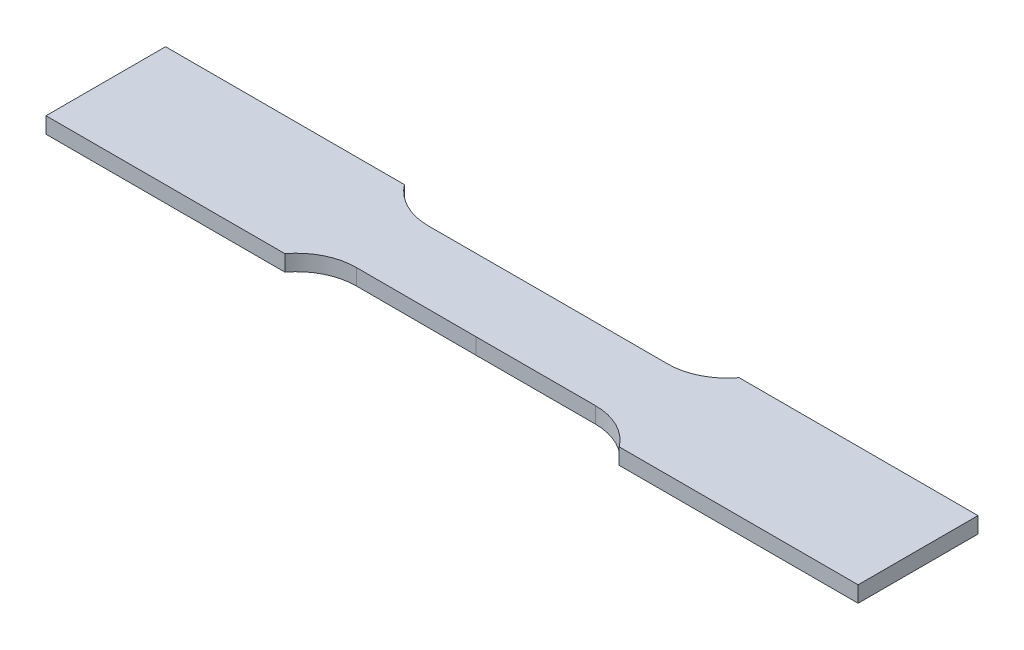
ISO-10303-21;
HEADER;
FILE_DESCRIPTION(('STEP AP214'),'2;1');
FILE_NAME('part.step','',(''),(''),'','','');
FILE_SCHEMA(('AUTOMOTIVE_DESIGN { 1 0 10303 214 1 1 1 1 }'));
ENDSEC;
DATA;
#1=APPLICATION_CONTEXT('core data for automotive mechanical design processes');
#2=APPLICATION_PROTOCOL_DEFINITION('international standard','automotive_design',2000,#1);
#3=PRODUCT_CONTEXT('',#1,'mechanical');
#4=PRODUCT('Part','Part','',(#3));
#5=PRODUCT_RELATED_PRODUCT_CATEGORY('part','',(#4));
#6=PRODUCT_DEFINITION_FORMATION('','',#4);
#7=PRODUCT_DEFINITION_CONTEXT('part definition',#1,'design');
#8=PRODUCT_DEFINITION('design','',#6,#7);
#9=PRODUCT_DEFINITION_SHAPE('','',#8);
#10=(LENGTH_UNIT() NAMED_UNIT(*) SI_UNIT(.MILLI.,.METRE.));
#11=(NAMED_UNIT(*) PLANE_ANGLE_UNIT() SI_UNIT($,.RADIAN.));
#12=(NAMED_UNIT(*) SI_UNIT($,.STERADIAN.) SOLID_ANGLE_UNIT());
#13=UNCERTAINTY_MEASURE_WITH_UNIT(LENGTH_MEASURE(1.E-05),#10,'distance_accuracy_value','');
#14=(GEOMETRIC_REPRESENTATION_CONTEXT(3) GLOBAL_UNCERTAINTY_ASSIGNED_CONTEXT((#13)) GLOBAL_UNIT_ASSIGNED_CONTEXT((#10,
#11,#12)) REPRESENTATION_CONTEXT('',''));
#15=CARTESIAN_POINT('',(0.,0.,0.));
#16=DIRECTION('',(0.,0.,1.));
#17=DIRECTION('',(1.,0.,0.));
#18=AXIS2_PLACEMENT_3D('',#15,#16,#17);
#19=CARTESIAN_POINT('',(0.,3.357,-12.5450081546003));
#20=DIRECTION('',(0.,0.,-1.));
#21=DIRECTION('',(-1.,0.,0.));
#22=AXIS2_PLACEMENT_3D('',#19,#20,#21);
#23=PLANE('',#22);
#24=DIRECTION('',(1.,0.,0.));
#25=VECTOR('',#24,1.);
#26=CARTESIAN_POINT('',(0.,0.,-12.5450081546003));
#27=LINE('',#26,#25);
#28=CARTESIAN_POINT('',(35.,0.,-12.5450081546003));
#29=VERTEX_POINT('',#28);
#30=CARTESIAN_POINT('',(85.,0.,-12.5450081546003));
#31=VERTEX_POINT('',#30);
#32=EDGE_CURVE('E168',#29,#31,#27,.T.);
#33=ORIENTED_EDGE('',*,*,#32,.F.);
#34=DIRECTION('',(0.,-1.,0.));
#35=VECTOR('',#34,1.);
#36=CARTESIAN_POINT('',(35.,3.357,-12.5450081546003));
#37=LINE('',#36,#35);
#38=CARTESIAN_POINT('',(35.,3.357,-12.5450081546003));
#39=VERTEX_POINT('',#38);
#40=EDGE_CURVE('E11',#39,#29,#37,.T.);
#41=ORIENTED_EDGE('',*,*,#40,.F.);
#42=DIRECTION('',(1.,0.,0.));
#43=VECTOR('',#42,1.);
#44=CARTESIAN_POINT('',(0.,3.357,-12.5450081546003));
#45=LINE('',#44,#43);
#46=CARTESIAN_POINT('',(85.,3.357,-12.5450081546003));
#47=VERTEX_POINT('',#46);
#48=EDGE_CURVE('E201',#39,#47,#45,.T.);
#49=ORIENTED_EDGE('',*,*,#48,.T.);
#50=DIRECTION('',(0.,-1.,0.));
#51=VECTOR('',#50,1.);
#52=CARTESIAN_POINT('',(85.,3.357,-12.5450081546003));
#53=LINE('',#52,#51);
#54=EDGE_CURVE('E53',#47,#31,#53,.T.);
#55=ORIENTED_EDGE('',*,*,#54,.T.);
#56=EDGE_LOOP('',(#33,#41,#49,#55));
#57=FACE_BOUND('',#56,.T.);
#58=ADVANCED_FACE('F37',(#57),#23,.T.);
#59=CARTESIAN_POINT('',(25.00749999865,3.357,-20.0549977500006));
#60=DIRECTION('',(0.,-1.,0.));
#61=DIRECTION('',(0.,0.,-1.));
#62=AXIS2_PLACEMENT_3D('',#59,#60,#61);
#63=CYLINDRICAL_SURFACE('',#62,12.5);
#64=CARTESIAN_POINT('',(25.00749999865,0.,-20.0549977500006));
#65=DIRECTION('',(0.,1.,0.));
#66=DIRECTION('',(0.,0.,1.));
#67=AXIS2_PLACEMENT_3D('',#64,#65,#66);
#68=CIRCLE('',#67,12.5);
#69=CARTESIAN_POINT('',(25.,0.,-7.55500000000001));
#70=VERTEX_POINT('',#69);
#71=EDGE_CURVE('E170',#29,#70,#68,.F.);
#72=ORIENTED_EDGE('',*,*,#71,.T.);
#73=DIRECTION('',(0.,-1.,0.));
#74=VECTOR('',#73,1.);
#75=CARTESIAN_POINT('',(25.,3.357,-7.55500000000001));
#76=LINE('',#75,#74);
#77=CARTESIAN_POINT('',(25.,3.357,-7.55500000000001));
#78=VERTEX_POINT('',#77);
#79=EDGE_CURVE('E45',#78,#70,#76,.T.);
#80=ORIENTED_EDGE('',*,*,#79,.F.);
#81=CARTESIAN_POINT('',(25.00749999865,3.357,-20.0549977500006));
#82=DIRECTION('',(0.,1.,0.));
#83=DIRECTION('',(0.,0.,1.));
#84=AXIS2_PLACEMENT_3D('',#81,#82,#83);
#85=CIRCLE('',#84,12.5);
#86=EDGE_CURVE('E250',#39,#78,#85,.F.);
#87=ORIENTED_EDGE('',*,*,#86,.F.);
#88=ORIENTED_EDGE('',*,*,#40,.T.);
#89=EDGE_LOOP('',(#72,#80,#87,#88));
#90=FACE_BOUND('',#89,.T.);
#91=ADVANCED_FACE('F283',(#90),#63,.F.);
#92=CARTESIAN_POINT('',(0.00454199836487909,3.357,-7.56999727480099));
#93=DIRECTION('',(-0.000599999891999831,0.,0.999999820000049));
#94=DIRECTION('',(0.999999820000049,0.,0.000599999891999831));
#95=AXIS2_PLACEMENT_3D('',#92,#93,#94);
#96=PLANE('',#95);
#97=DIRECTION('',(-0.999999820000049,0.,-0.000599999891999831));
#98=VECTOR('',#97,1.);
#99=CARTESIAN_POINT('',(0.00454199836487909,0.,-7.56999727480099));
#100=LINE('',#99,#98);
#101=CARTESIAN_POINT('',(0.,0.,-7.57));
#102=VERTEX_POINT('',#101);
#103=EDGE_CURVE('E172',#70,#102,#100,.T.);
#104=ORIENTED_EDGE('',*,*,#103,.T.);
#105=DIRECTION('',(0.,-1.,0.));
#106=VECTOR('',#105,1.);
#107=CARTESIAN_POINT('',(0.,3.357,-7.57));
#108=LINE('',#107,#106);
#109=CARTESIAN_POINT('',(0.,3.357,-7.57));
#110=VERTEX_POINT('',#109);
#111=EDGE_CURVE('E222',#110,#102,#108,.T.);
#112=ORIENTED_EDGE('',*,*,#111,.F.);
#113=DIRECTION('',(-0.999999820000049,0.,-0.000599999891999831));
#114=VECTOR('',#113,1.);
#115=CARTESIAN_POINT('',(0.00454199836487909,3.357,-7.56999727480099));
#116=LINE('',#115,#114);
#117=EDGE_CURVE('E231',#78,#110,#116,.T.);
#118=ORIENTED_EDGE('',*,*,#117,.F.);
#119=ORIENTED_EDGE('',*,*,#79,.T.);
#120=EDGE_LOOP('',(#104,#112,#118,#119));
#121=FACE_BOUND('',#120,.T.);
#122=ADVANCED_FACE('F229',(#121),#96,.F.);
#123=CARTESIAN_POINT('',(-0.0105979792279621,3.357,-7.56998516282909));
#124=DIRECTION('',(0.0013999986280022,0.,0.999999020001441));
#125=DIRECTION('',(0.999999020001441,0.,-0.0013999986280022));
#126=AXIS2_PLACEMENT_3D('',#123,#124,#125);
#127=PLANE('',#126);
#128=DIRECTION('',(-0.999999020001441,0.,0.0013999986280022));
#129=VECTOR('',#128,1.);
#130=CARTESIAN_POINT('',(-0.0105979792279621,0.,-7.56998516282909));
#131=LINE('',#130,#129);
#132=CARTESIAN_POINT('',(-25.,0.,-7.535));
#133=VERTEX_POINT('',#132);
#134=EDGE_CURVE('E174',#102,#133,#131,.T.);
#135=ORIENTED_EDGE('',*,*,#134,.T.);
#136=DIRECTION('',(0.,-1.,0.));
#137=VECTOR('',#136,1.);
#138=CARTESIAN_POINT('',(-25.,3.357,-7.535));
#139=LINE('',#138,#137);
#140=CARTESIAN_POINT('',(-25.,3.357,-7.535));
#141=VERTEX_POINT('',#140);
#142=EDGE_CURVE('E220',#141,#133,#139,.T.);
#143=ORIENTED_EDGE('',*,*,#142,.F.);
#144=DIRECTION('',(-0.999999020001441,0.,0.0013999986280022));
#145=VECTOR('',#144,1.);
#146=CARTESIAN_POINT('',(-0.0105979792279621,3.357,-7.56998516282909));
#147=LINE('',#146,#145);
#148=EDGE_CURVE('E244',#110,#141,#147,.T.);
#149=ORIENTED_EDGE('',*,*,#148,.F.);
#150=ORIENTED_EDGE('',*,*,#111,.T.);
#151=EDGE_LOOP('',(#135,#143,#149,#150));
#152=FACE_BOUND('',#151,.T.);
#153=ADVANCED_FACE('F241',(#152),#127,.F.);
#154=CARTESIAN_POINT('',(-25.01749998285,3.357,-20.034987750018));
#155=DIRECTION('',(0.,-1.,0.));
#156=DIRECTION('',(0.,0.,-1.));
#157=AXIS2_PLACEMENT_3D('',#154,#155,#156);
#158=CYLINDRICAL_SURFACE('',#157,12.5);
#159=CARTESIAN_POINT('',(-25.01749998285,0.,-20.034987750018));
#160=DIRECTION('',(0.,1.,0.));
#161=DIRECTION('',(0.,0.,1.));
#162=AXIS2_PLACEMENT_3D('',#159,#160,#161);
#163=CIRCLE('',#162,12.5);
#164=CARTESIAN_POINT('',(-35.,0.,-12.511710976723));
#165=VERTEX_POINT('',#164);
#166=EDGE_CURVE('E177',#165,#133,#163,.T.);
#167=ORIENTED_EDGE('',*,*,#166,.F.);
#168=DIRECTION('',(0.,-1.,0.));
#169=VECTOR('',#168,1.);
#170=CARTESIAN_POINT('',(-35.,3.357,-12.511710976723));
#171=LINE('',#170,#169);
#172=CARTESIAN_POINT('',(-35.,3.357,-12.511710976723));
#173=VERTEX_POINT('',#172);
#174=EDGE_CURVE('E218',#173,#165,#171,.T.);
#175=ORIENTED_EDGE('',*,*,#174,.F.);
#176=CARTESIAN_POINT('',(-25.01749998285,3.357,-20.034987750018));
#177=DIRECTION('',(0.,1.,0.));
#178=DIRECTION('',(0.,0.,1.));
#179=AXIS2_PLACEMENT_3D('',#176,#177,#178);
#180=CIRCLE('',#179,12.5);
#181=EDGE_CURVE('E246',#173,#141,#180,.T.);
#182=ORIENTED_EDGE('',*,*,#181,.T.);
#183=ORIENTED_EDGE('',*,*,#142,.T.);
#184=EDGE_LOOP('',(#167,#175,#182,#183));
#185=FACE_BOUND('',#184,.T.);
#186=ADVANCED_FACE('F294',(#185),#158,.F.);
#187=CARTESIAN_POINT('',(0.,3.357,-12.511710976723));
#188=DIRECTION('',(0.,0.,1.));
#189=DIRECTION('',(1.,0.,0.));
#190=AXIS2_PLACEMENT_3D('',#187,#188,#189);
#191=PLANE('',#190);
#192=DIRECTION('',(-1.,0.,0.));
#193=VECTOR('',#192,1.);
#194=CARTESIAN_POINT('',(0.,0.,-12.511710976723));
#195=LINE('',#194,#193);
#196=CARTESIAN_POINT('',(-85.,0.,-12.5117109767229));
#197=VERTEX_POINT('',#196);
#198=EDGE_CURVE('E180',#165,#197,#195,.T.);
#199=ORIENTED_EDGE('',*,*,#198,.T.);
#200=DIRECTION('',(0.,-1.,0.));
#201=VECTOR('',#200,1.);
#202=CARTESIAN_POINT('',(-85.,3.357,-12.5117109767229));
#203=LINE('',#202,#201);
#204=CARTESIAN_POINT('',(-85.,3.357,-12.5117109767229));
#205=VERTEX_POINT('',#204);
#206=EDGE_CURVE('E215',#205,#197,#203,.T.);
#207=ORIENTED_EDGE('',*,*,#206,.F.);
#208=DIRECTION('',(-1.,0.,0.));
#209=VECTOR('',#208,1.);
#210=CARTESIAN_POINT('',(0.,3.357,-12.511710976723));
#211=LINE('',#210,#209);
#212=EDGE_CURVE('E248',#173,#205,#211,.T.);
#213=ORIENTED_EDGE('',*,*,#212,.F.);
#214=ORIENTED_EDGE('',*,*,#174,.T.);
#215=EDGE_LOOP('',(#199,#207,#213,#214));
#216=FACE_BOUND('',#215,.T.);
#217=ADVANCED_FACE('F297',(#216),#191,.F.);
#218=CARTESIAN_POINT('',(-85.,3.357,0.));
#219=DIRECTION('',(1.,0.,0.));
#220=DIRECTION('',(0.,0.,-1.));
#221=AXIS2_PLACEMENT_3D('',#218,#219,#220);
#222=PLANE('',#221);
#223=DIRECTION('',(0.,0.,1.));
#224=VECTOR('',#223,1.);
#225=CARTESIAN_POINT('',(-85.,0.,0.));
#226=LINE('',#225,#224);
#227=CARTESIAN_POINT('',(-85.,0.,12.5117109767229));
#228=VERTEX_POINT('',#227);
#229=EDGE_CURVE('E182',#197,#228,#226,.T.);
#230=ORIENTED_EDGE('',*,*,#229,.T.);
#231=DIRECTION('',(0.,-1.,0.));
#232=VECTOR('',#231,1.);
#233=CARTESIAN_POINT('',(-85.,3.357,12.5117109767229));
#234=LINE('',#233,#232);
#235=CARTESIAN_POINT('',(-85.,3.357,12.5117109767229));
#236=VERTEX_POINT('',#235);
#237=EDGE_CURVE('E213',#236,#228,#234,.T.);
#238=ORIENTED_EDGE('',*,*,#237,.F.);
#239=DIRECTION('',(0.,0.,1.));
#240=VECTOR('',#239,1.);
#241=CARTESIAN_POINT('',(-85.,3.357,0.));
#242=LINE('',#241,#240);
#243=EDGE_CURVE('E255',#205,#236,#242,.T.);
#244=ORIENTED_EDGE('',*,*,#243,.F.);
#245=ORIENTED_EDGE('',*,*,#206,.T.);
#246=EDGE_LOOP('',(#230,#238,#244,#245));
#247=FACE_BOUND('',#246,.T.);
#248=ADVANCED_FACE('F301',(#247),#222,.F.);
#249=CARTESIAN_POINT('',(0.,3.357,12.511710976723));
#250=DIRECTION('',(0.,0.,1.));
#251=DIRECTION('',(1.,0.,0.));
#252=AXIS2_PLACEMENT_3D('',#249,#250,#251);
#253=PLANE('',#252);
#254=DIRECTION('',(-1.,0.,0.));
#255=VECTOR('',#254,1.);
#256=CARTESIAN_POINT('',(0.,0.,12.511710976723));
#257=LINE('',#256,#255);
#258=CARTESIAN_POINT('',(-35.,0.,12.511710976723));
#259=VERTEX_POINT('',#258);
#260=EDGE_CURVE('E185',#259,#228,#257,.T.);
#261=ORIENTED_EDGE('',*,*,#260,.F.);
#262=DIRECTION('',(0.,-1.,0.));
#263=VECTOR('',#262,1.);
#264=CARTESIAN_POINT('',(-35.,3.357,12.511710976723));
#265=LINE('',#264,#263);
#266=CARTESIAN_POINT('',(-35.,3.357,12.511710976723));
#267=VERTEX_POINT('',#266);
#268=EDGE_CURVE('E211',#267,#259,#265,.T.);
#269=ORIENTED_EDGE('',*,*,#268,.F.);
#270=DIRECTION('',(-1.,0.,0.));
#271=VECTOR('',#270,1.);
#272=CARTESIAN_POINT('',(0.,3.357,12.511710976723));
#273=LINE('',#272,#271);
#274=EDGE_CURVE('E257',#267,#236,#273,.T.);
#275=ORIENTED_EDGE('',*,*,#274,.T.);
#276=ORIENTED_EDGE('',*,*,#237,.T.);
#277=EDGE_LOOP('',(#261,#269,#275,#276));
#278=FACE_BOUND('',#277,.T.);
#279=ADVANCED_FACE('F305',(#278),#253,.T.);
#280=CARTESIAN_POINT('',(-25.01749998285,3.357,20.034987750018));
#281=DIRECTION('',(0.,-1.,0.));
#282=DIRECTION('',(0.,0.,-1.));
#283=AXIS2_PLACEMENT_3D('',#280,#281,#282);
#284=CYLINDRICAL_SURFACE('',#283,12.5);
#285=CARTESIAN_POINT('',(-25.01749998285,0.,20.034987750018));
#286=DIRECTION('',(0.,1.,0.));
#287=DIRECTION('',(0.,0.,1.));
#288=AXIS2_PLACEMENT_3D('',#285,#286,#287);
#289=CIRCLE('',#288,12.5);
#290=CARTESIAN_POINT('',(-25.,0.,7.535));
#291=VERTEX_POINT('',#290);
#292=EDGE_CURVE('E188',#259,#291,#289,.F.);
#293=ORIENTED_EDGE('',*,*,#292,.T.);
#294=DIRECTION('',(0.,-1.,0.));
#295=VECTOR('',#294,1.);
#296=CARTESIAN_POINT('',(-25.,3.357,7.535));
#297=LINE('',#296,#295);
#298=CARTESIAN_POINT('',(-25.,3.357,7.535));
#299=VERTEX_POINT('',#298);
#300=EDGE_CURVE('E208',#299,#291,#297,.T.);
#301=ORIENTED_EDGE('',*,*,#300,.F.);
#302=CARTESIAN_POINT('',(-25.01749998285,3.357,20.034987750018));
#303=DIRECTION('',(0.,1.,0.));
#304=DIRECTION('',(0.,0.,1.));
#305=AXIS2_PLACEMENT_3D('',#302,#303,#304);
#306=CIRCLE('',#305,12.5);
#307=EDGE_CURVE('E260',#267,#299,#306,.F.);
#308=ORIENTED_EDGE('',*,*,#307,.F.);
#309=ORIENTED_EDGE('',*,*,#268,.T.);
#310=EDGE_LOOP('',(#293,#301,#308,#309));
#311=FACE_BOUND('',#310,.T.);
#312=ADVANCED_FACE('F309',(#311),#284,.F.);
#313=CARTESIAN_POINT('',(-0.0105979792279595,3.357,7.56998516282908));
#314=DIRECTION('',(0.00139999862800186,0.,-0.999999020001441));
#315=DIRECTION('',(-0.999999020001441,0.,-0.00139999862800186));
#316=AXIS2_PLACEMENT_3D('',#313,#314,#315);
#317=PLANE('',#316);
#318=DIRECTION('',(0.999999020001441,0.,0.00139999862800186));
#319=VECTOR('',#318,1.);
#320=CARTESIAN_POINT('',(-0.0105979792279595,0.,7.56998516282908));
#321=LINE('',#320,#319);
#322=CARTESIAN_POINT('',(0.,0.,7.57));
#323=VERTEX_POINT('',#322);
#324=EDGE_CURVE('E190',#291,#323,#321,.T.);
#325=ORIENTED_EDGE('',*,*,#324,.T.);
#326=DIRECTION('',(0.,-1.,0.));
#327=VECTOR('',#326,1.);
#328=CARTESIAN_POINT('',(0.,3.357,7.57));
#329=LINE('',#328,#327);
#330=CARTESIAN_POINT('',(0.,3.357,7.57));
#331=VERTEX_POINT('',#330);
#332=EDGE_CURVE('E205',#331,#323,#329,.T.);
#333=ORIENTED_EDGE('',*,*,#332,.F.);
#334=DIRECTION('',(0.999999020001441,0.,0.00139999862800186));
#335=VECTOR('',#334,1.);
#336=CARTESIAN_POINT('',(-0.0105979792279595,3.357,7.56998516282908));
#337=LINE('',#336,#335);
#338=EDGE_CURVE('E163',#299,#331,#337,.T.);
#339=ORIENTED_EDGE('',*,*,#338,.F.);
#340=ORIENTED_EDGE('',*,*,#300,.T.);
#341=EDGE_LOOP('',(#325,#333,#339,#340));
#342=FACE_BOUND('',#341,.T.);
#343=ADVANCED_FACE('F267',(#342),#317,.F.);
#344=CARTESIAN_POINT('',(0.00454199836488224,3.357,7.56999727480098));
#345=DIRECTION('',(-0.000599999892000247,0.,-0.999999820000049));
#346=DIRECTION('',(-0.999999820000049,0.,0.000599999892000247));
#347=AXIS2_PLACEMENT_3D('',#344,#345,#346);
#348=PLANE('',#347);
#349=DIRECTION('',(0.999999820000049,0.,-0.000599999892000248));
#350=VECTOR('',#349,1.);
#351=CARTESIAN_POINT('',(0.00454199836488224,0.,7.56999727480098));
#352=LINE('',#351,#350);
#353=CARTESIAN_POINT('',(25.,0.,7.55499999999999));
#354=VERTEX_POINT('',#353);
#355=EDGE_CURVE('E192',#323,#354,#352,.T.);
#356=ORIENTED_EDGE('',*,*,#355,.T.);
#357=DIRECTION('',(0.,-1.,0.));
#358=VECTOR('',#357,1.);
#359=CARTESIAN_POINT('',(25.,3.357,7.55499999999999));
#360=LINE('',#359,#358);
#361=CARTESIAN_POINT('',(25.,3.357,7.55499999999999));
#362=VERTEX_POINT('',#361);
#363=EDGE_CURVE('E149',#362,#354,#360,.T.);
#364=ORIENTED_EDGE('',*,*,#363,.F.);
#365=DIRECTION('',(0.999999820000049,0.,-0.000599999892000248));
#366=VECTOR('',#365,1.);
#367=CARTESIAN_POINT('',(0.00454199836488224,3.357,7.56999727480098));
#368=LINE('',#367,#366);
#369=EDGE_CURVE('E160',#331,#362,#368,.T.);
#370=ORIENTED_EDGE('',*,*,#369,.F.);
#371=ORIENTED_EDGE('',*,*,#332,.T.);
#372=EDGE_LOOP('',(#356,#364,#370,#371));
#373=FACE_BOUND('',#372,.T.);
#374=ADVANCED_FACE('F271',(#373),#348,.F.);
#375=CARTESIAN_POINT('',(25.00749999865,3.357,20.0549977500006));
#376=DIRECTION('',(0.,-1.,0.));
#377=DIRECTION('',(0.,0.,-1.));
#378=AXIS2_PLACEMENT_3D('',#375,#376,#377);
#379=CYLINDRICAL_SURFACE('',#378,12.5);
#380=CARTESIAN_POINT('',(25.00749999865,0.,20.0549977500006));
#381=DIRECTION('',(0.,1.,0.));
#382=DIRECTION('',(0.,0.,1.));
#383=AXIS2_PLACEMENT_3D('',#380,#381,#382);
#384=CIRCLE('',#383,12.5);
#385=CARTESIAN_POINT('',(35.,0.,12.5450081546003));
#386=VERTEX_POINT('',#385);
#387=EDGE_CURVE('E146',#386,#354,#384,.T.);
#388=ORIENTED_EDGE('',*,*,#387,.F.);
#389=DIRECTION('',(0.,-1.,0.));
#390=VECTOR('',#389,1.);
#391=CARTESIAN_POINT('',(35.,3.357,12.5450081546003));
#392=LINE('',#391,#390);
#393=CARTESIAN_POINT('',(35.,3.357,12.5450081546003));
#394=VERTEX_POINT('',#393);
#395=EDGE_CURVE('E140',#394,#386,#392,.T.);
#396=ORIENTED_EDGE('',*,*,#395,.F.);
#397=CARTESIAN_POINT('',(25.00749999865,3.357,20.0549977500006));
#398=DIRECTION('',(0.,1.,0.));
#399=DIRECTION('',(0.,0.,1.));
#400=AXIS2_PLACEMENT_3D('',#397,#398,#399);
#401=CIRCLE('',#400,12.5);
#402=EDGE_CURVE('E144',#394,#362,#401,.T.);
#403=ORIENTED_EDGE('',*,*,#402,.T.);
#404=ORIENTED_EDGE('',*,*,#363,.T.);
#405=EDGE_LOOP('',(#388,#396,#403,#404));
#406=FACE_BOUND('',#405,.T.);
#407=ADVANCED_FACE('F142',(#406),#379,.F.);
#408=CARTESIAN_POINT('',(0.,3.357,12.5450081546003));
#409=DIRECTION('',(0.,0.,-1.));
#410=DIRECTION('',(-1.,0.,0.));
#411=AXIS2_PLACEMENT_3D('',#408,#409,#410);
#412=PLANE('',#411);
#413=DIRECTION('',(1.,0.,0.));
#414=VECTOR('',#413,1.);
#415=CARTESIAN_POINT('',(0.,0.,12.5450081546003));
#416=LINE('',#415,#414);
#417=CARTESIAN_POINT('',(85.,0.,12.5450081546003));
#418=VERTEX_POINT('',#417);
#419=EDGE_CURVE('E196',#386,#418,#416,.T.);
#420=ORIENTED_EDGE('',*,*,#419,.T.);
#421=DIRECTION('',(0.,-1.,0.));
#422=VECTOR('',#421,1.);
#423=CARTESIAN_POINT('',(85.,3.357,12.5450081546003));
#424=LINE('',#423,#422);
#425=CARTESIAN_POINT('',(85.,3.357,12.5450081546003));
#426=VERTEX_POINT('',#425);
#427=EDGE_CURVE('E97',#426,#418,#424,.T.);
#428=ORIENTED_EDGE('',*,*,#427,.F.);
#429=DIRECTION('',(1.,0.,0.));
#430=VECTOR('',#429,1.);
#431=CARTESIAN_POINT('',(0.,3.357,12.5450081546003));
#432=LINE('',#431,#430);
#433=EDGE_CURVE('E151',#394,#426,#432,.T.);
#434=ORIENTED_EDGE('',*,*,#433,.F.);
#435=ORIENTED_EDGE('',*,*,#395,.T.);
#436=EDGE_LOOP('',(#420,#428,#434,#435));
#437=FACE_BOUND('',#436,.T.);
#438=ADVANCED_FACE('F152',(#437),#412,.F.);
#439=CARTESIAN_POINT('',(85.,3.357,0.));
#440=DIRECTION('',(1.,0.,0.));
#441=DIRECTION('',(0.,0.,-1.));
#442=AXIS2_PLACEMENT_3D('',#439,#440,#441);
#443=PLANE('',#442);
#444=DIRECTION('',(0.,0.,1.));
#445=VECTOR('',#444,1.);
#446=CARTESIAN_POINT('',(85.,0.,0.));
#447=LINE('',#446,#445);
#448=EDGE_CURVE('E198',#31,#418,#447,.T.);
#449=ORIENTED_EDGE('',*,*,#448,.F.);
#450=ORIENTED_EDGE('',*,*,#54,.F.);
#451=DIRECTION('',(0.,0.,1.));
#452=VECTOR('',#451,1.);
#453=CARTESIAN_POINT('',(85.,3.357,0.));
#454=LINE('',#453,#452);
#455=EDGE_CURVE('E155',#47,#426,#454,.T.);
#456=ORIENTED_EDGE('',*,*,#455,.T.);
#457=ORIENTED_EDGE('',*,*,#427,.T.);
#458=EDGE_LOOP('',(#449,#450,#456,#457));
#459=FACE_BOUND('',#458,.T.);
#460=ADVANCED_FACE('F272',(#459),#443,.T.);
#461=CARTESIAN_POINT('',(0.,3.357,0.));
#462=DIRECTION('',(0.,1.,0.));
#463=DIRECTION('',(0.,0.,1.));
#464=AXIS2_PLACEMENT_3D('',#461,#462,#463);
#465=PLANE('',#464);
#466=ORIENTED_EDGE('',*,*,#48,.F.);
#467=ORIENTED_EDGE('',*,*,#86,.T.);
#468=ORIENTED_EDGE('',*,*,#117,.T.);
#469=ORIENTED_EDGE('',*,*,#148,.T.);
#470=ORIENTED_EDGE('',*,*,#181,.F.);
#471=ORIENTED_EDGE('',*,*,#212,.T.);
#472=ORIENTED_EDGE('',*,*,#243,.T.);
#473=ORIENTED_EDGE('',*,*,#274,.F.);
#474=ORIENTED_EDGE('',*,*,#307,.T.);
#475=ORIENTED_EDGE('',*,*,#338,.T.);
#476=ORIENTED_EDGE('',*,*,#369,.T.);
#477=ORIENTED_EDGE('',*,*,#402,.F.);
#478=ORIENTED_EDGE('',*,*,#433,.T.);
#479=ORIENTED_EDGE('',*,*,#455,.F.);
#480=EDGE_LOOP('',(#466,#467,#468,#469,#470,#471,#472,#473,#474,#475,#476,#477,#478,#479));
#481=FACE_BOUND('',#480,.T.);
#482=ADVANCED_FACE('F158',(#481),#465,.T.);
#483=CARTESIAN_POINT('',(0.,0.,0.));
#484=DIRECTION('',(0.,1.,0.));
#485=DIRECTION('',(0.,0.,1.));
#486=AXIS2_PLACEMENT_3D('',#483,#484,#485);
#487=PLANE('',#486);
#488=ORIENTED_EDGE('',*,*,#32,.T.);
#489=ORIENTED_EDGE('',*,*,#448,.T.);
#490=ORIENTED_EDGE('',*,*,#419,.F.);
#491=ORIENTED_EDGE('',*,*,#387,.T.);
#492=ORIENTED_EDGE('',*,*,#355,.F.);
#493=ORIENTED_EDGE('',*,*,#324,.F.);
#494=ORIENTED_EDGE('',*,*,#292,.F.);
#495=ORIENTED_EDGE('',*,*,#260,.T.);
#496=ORIENTED_EDGE('',*,*,#229,.F.);
#497=ORIENTED_EDGE('',*,*,#198,.F.);
#498=ORIENTED_EDGE('',*,*,#166,.T.);
#499=ORIENTED_EDGE('',*,*,#134,.F.);
#500=ORIENTED_EDGE('',*,*,#103,.F.);
#501=ORIENTED_EDGE('',*,*,#71,.F.);
#502=EDGE_LOOP('',(#488,#489,#490,#491,#492,#493,#494,#495,#496,#497,#498,#499,#500,#501));
#503=FACE_BOUND('',#502,.T.);
#504=ADVANCED_FACE('F236',(#503),#487,.F.);
#505=CLOSED_SHELL('',(#58,#91,#122,#153,#186,#217,#248,#279,#312,#343,#374,#407,#438,#460,#482,#504));
#506=MANIFOLD_SOLID_BREP('B2',#505);
#507=ADVANCED_BREP_SHAPE_REPRESENTATION('',(#18,#506),#14);
#508=SHAPE_DEFINITION_REPRESENTATION(#9,#507);
ENDSEC;
END-ISO-10303-21;
